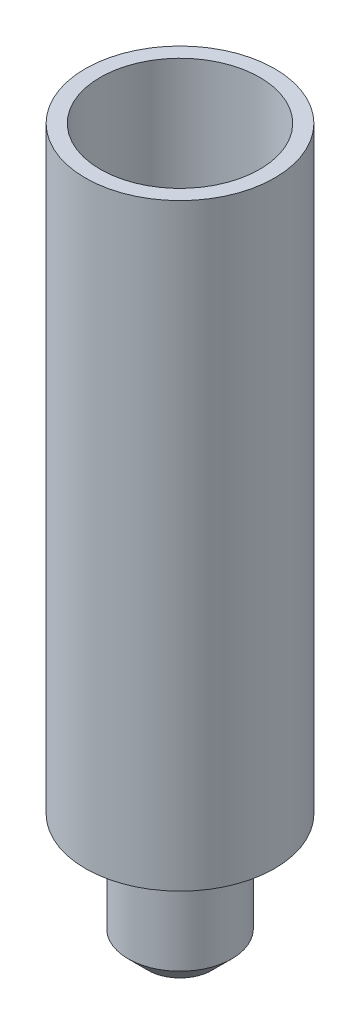
ISO-10303-21;
HEADER;
FILE_DESCRIPTION(('STEP AP214'),'2;1');
FILE_NAME('part.step','',(''),(''),'','','');
FILE_SCHEMA(('AUTOMOTIVE_DESIGN { 1 0 10303 214 1 1 1 1 }'));
ENDSEC;
DATA;
#1=APPLICATION_CONTEXT('core data for automotive mechanical design processes');
#2=APPLICATION_PROTOCOL_DEFINITION('international standard','automotive_design',2000,#1);
#3=PRODUCT_CONTEXT('',#1,'mechanical');
#4=PRODUCT('Part','Part','',(#3));
#5=PRODUCT_RELATED_PRODUCT_CATEGORY('part','',(#4));
#6=PRODUCT_DEFINITION_FORMATION('','',#4);
#7=PRODUCT_DEFINITION_CONTEXT('part definition',#1,'design');
#8=PRODUCT_DEFINITION('design','',#6,#7);
#9=PRODUCT_DEFINITION_SHAPE('','',#8);
#10=(LENGTH_UNIT() NAMED_UNIT(*) SI_UNIT(.MILLI.,.METRE.));
#11=(NAMED_UNIT(*) PLANE_ANGLE_UNIT() SI_UNIT($,.RADIAN.));
#12=(NAMED_UNIT(*) SI_UNIT($,.STERADIAN.) SOLID_ANGLE_UNIT());
#13=UNCERTAINTY_MEASURE_WITH_UNIT(LENGTH_MEASURE(1.E-05),#10,'distance_accuracy_value','');
#14=(GEOMETRIC_REPRESENTATION_CONTEXT(3) GLOBAL_UNCERTAINTY_ASSIGNED_CONTEXT((#13)) GLOBAL_UNIT_ASSIGNED_CONTEXT((#10,
#11,#12)) REPRESENTATION_CONTEXT('',''));
#15=CARTESIAN_POINT('',(0.,0.,0.));
#16=DIRECTION('',(0.,0.,1.));
#17=DIRECTION('',(1.,0.,0.));
#18=AXIS2_PLACEMENT_3D('',#15,#16,#17);
#19=CARTESIAN_POINT('',(0.,6.,0.));
#20=DIRECTION('',(0.,-1.,0.));
#21=DIRECTION('',(0.,0.,-1.));
#22=AXIS2_PLACEMENT_3D('',#19,#20,#21);
#23=CYLINDRICAL_SURFACE('',#22,2.6);
#24=CARTESIAN_POINT('',(0.,0.99999999999999,0.));
#25=DIRECTION('',(0.,1.,0.));
#26=DIRECTION('',(0.,0.,1.));
#27=AXIS2_PLACEMENT_3D('',#24,#25,#26);
#28=CIRCLE('',#27,2.6);
#29=CARTESIAN_POINT('',(0.,0.99999999999999,2.6));
#30=VERTEX_POINT('',#29);
#31=EDGE_CURVE('E46',#30,#30,#28,.T.);
#32=ORIENTED_EDGE('',*,*,#31,.T.);
#33=EDGE_LOOP('',(#32));
#34=FACE_BOUND('',#33,.T.);
#35=CARTESIAN_POINT('',(0.,6.,0.));
#36=DIRECTION('',(0.,1.,0.));
#37=DIRECTION('',(0.,0.,1.));
#38=AXIS2_PLACEMENT_3D('',#35,#36,#37);
#39=CIRCLE('',#38,2.6);
#40=CARTESIAN_POINT('',(0.,6.,2.6));
#41=VERTEX_POINT('',#40);
#42=EDGE_CURVE('E54',#41,#41,#39,.T.);
#43=ORIENTED_EDGE('',*,*,#42,.F.);
#44=EDGE_LOOP('',(#43));
#45=FACE_BOUND('',#44,.T.);
#46=ADVANCED_FACE('F38',(#34,#45),#23,.T.);
#47=CARTESIAN_POINT('',(0.,0.,0.));
#48=DIRECTION('',(0.,1.,0.));
#49=DIRECTION('',(0.,0.,1.));
#50=AXIS2_PLACEMENT_3D('',#47,#48,#49);
#51=PLANE('',#50);
#52=CARTESIAN_POINT('',(0.,0.,0.));
#53=DIRECTION('',(0.,1.,0.));
#54=DIRECTION('',(0.,0.,1.));
#55=AXIS2_PLACEMENT_3D('',#52,#53,#54);
#56=CIRCLE('',#55,1.60000000000001);
#57=CARTESIAN_POINT('',(0.,0.,1.60000000000001));
#58=VERTEX_POINT('',#57);
#59=EDGE_CURVE('E10',#58,#58,#56,.F.);
#60=ORIENTED_EDGE('',*,*,#59,.T.);
#61=EDGE_LOOP('',(#60));
#62=FACE_BOUND('',#61,.T.);
#63=CARTESIAN_POINT('',(0.,0.,0.));
#64=DIRECTION('',(0.,-1.,0.));
#65=DIRECTION('',(0.,0.,-1.));
#66=AXIS2_PLACEMENT_3D('',#63,#64,#65);
#67=CIRCLE('',#66,1.025);
#68=CARTESIAN_POINT('',(0.,0.,-1.025));
#69=VERTEX_POINT('',#68);
#70=EDGE_CURVE('E74',#69,#69,#67,.T.);
#71=ORIENTED_EDGE('',*,*,#70,.F.);
#72=EDGE_LOOP('',(#71));
#73=FACE_BOUND('',#72,.T.);
#74=ADVANCED_FACE('F80',(#62,#73),#51,.F.);
#75=CARTESIAN_POINT('',(0.,8.5,0.));
#76=DIRECTION('',(0.,-1.,0.));
#77=DIRECTION('',(0.,0.,-1.));
#78=AXIS2_PLACEMENT_3D('',#75,#76,#77);
#79=CYLINDRICAL_SURFACE('',#78,4.75);
#80=CARTESIAN_POINT('',(0.,6.,0.));
#81=DIRECTION('',(0.,1.,0.));
#82=DIRECTION('',(0.,0.,1.));
#83=AXIS2_PLACEMENT_3D('',#80,#81,#82);
#84=CIRCLE('',#83,4.75);
#85=CARTESIAN_POINT('',(0.,6.,4.75));
#86=VERTEX_POINT('',#85);
#87=EDGE_CURVE('E59',#86,#86,#84,.T.);
#88=ORIENTED_EDGE('',*,*,#87,.T.);
#89=EDGE_LOOP('',(#88));
#90=FACE_BOUND('',#89,.T.);
#91=CARTESIAN_POINT('',(0.,36.,0.));
#92=DIRECTION('',(0.,1.,0.));
#93=DIRECTION('',(0.,0.,1.));
#94=AXIS2_PLACEMENT_3D('',#91,#92,#93);
#95=CIRCLE('',#94,4.75);
#96=CARTESIAN_POINT('',(0.,36.,4.75));
#97=VERTEX_POINT('',#96);
#98=EDGE_CURVE('E62',#97,#97,#95,.T.);
#99=ORIENTED_EDGE('',*,*,#98,.F.);
#100=EDGE_LOOP('',(#99));
#101=FACE_BOUND('',#100,.T.);
#102=ADVANCED_FACE('F82',(#90,#101),#79,.T.);
#103=CARTESIAN_POINT('',(0.,6.,0.));
#104=DIRECTION('',(0.,1.,0.));
#105=DIRECTION('',(0.,0.,1.));
#106=AXIS2_PLACEMENT_3D('',#103,#104,#105);
#107=PLANE('',#106);
#108=ORIENTED_EDGE('',*,*,#42,.T.);
#109=EDGE_LOOP('',(#108));
#110=FACE_BOUND('',#109,.T.);
#111=ORIENTED_EDGE('',*,*,#87,.F.);
#112=EDGE_LOOP('',(#111));
#113=FACE_BOUND('',#112,.T.);
#114=ADVANCED_FACE('F88',(#110,#113),#107,.F.);
#115=CARTESIAN_POINT('',(0.,36.,0.));
#116=DIRECTION('',(0.,1.,0.));
#117=DIRECTION('',(0.,0.,1.));
#118=AXIS2_PLACEMENT_3D('',#115,#116,#117);
#119=PLANE('',#118);
#120=ORIENTED_EDGE('',*,*,#98,.T.);
#121=EDGE_LOOP('',(#120));
#122=FACE_BOUND('',#121,.T.);
#123=CARTESIAN_POINT('',(0.,36.,0.));
#124=DIRECTION('',(0.,1.,0.));
#125=DIRECTION('',(0.,0.,1.));
#126=AXIS2_PLACEMENT_3D('',#123,#124,#125);
#127=CIRCLE('',#126,4.);
#128=CARTESIAN_POINT('',(0.,36.,4.));
#129=VERTEX_POINT('',#128);
#130=EDGE_CURVE('E65',#129,#129,#127,.T.);
#131=ORIENTED_EDGE('',*,*,#130,.F.);
#132=EDGE_LOOP('',(#131));
#133=FACE_BOUND('',#132,.T.);
#134=ADVANCED_FACE('F94',(#122,#133),#119,.T.);
#135=CARTESIAN_POINT('',(0.,36.,0.));
#136=DIRECTION('',(0.,-1.,0.));
#137=DIRECTION('',(0.,0.,-1.));
#138=AXIS2_PLACEMENT_3D('',#135,#136,#137);
#139=CYLINDRICAL_SURFACE('',#138,4.);
#140=ORIENTED_EDGE('',*,*,#130,.T.);
#141=EDGE_LOOP('',(#140));
#142=FACE_BOUND('',#141,.T.);
#143=CARTESIAN_POINT('',(0.,8.5,0.));
#144=DIRECTION('',(0.,1.,0.));
#145=DIRECTION('',(0.,0.,1.));
#146=AXIS2_PLACEMENT_3D('',#143,#144,#145);
#147=CIRCLE('',#146,4.);
#148=CARTESIAN_POINT('',(0.,8.5,4.));
#149=VERTEX_POINT('',#148);
#150=EDGE_CURVE('E50',#149,#149,#147,.F.);
#151=ORIENTED_EDGE('',*,*,#150,.T.);
#152=EDGE_LOOP('',(#151));
#153=FACE_BOUND('',#152,.T.);
#154=ADVANCED_FACE('F100',(#142,#153),#139,.F.);
#155=CARTESIAN_POINT('',(0.,8.5,0.));
#156=DIRECTION('',(0.,1.,0.));
#157=DIRECTION('',(0.,0.,1.));
#158=AXIS2_PLACEMENT_3D('',#155,#156,#157);
#159=PLANE('',#158);
#160=CARTESIAN_POINT('',(0.,8.5,0.));
#161=DIRECTION('',(0.,1.,0.));
#162=DIRECTION('',(0.,0.,1.));
#163=AXIS2_PLACEMENT_3D('',#160,#161,#162);
#164=CIRCLE('',#163,0.799999999999999);
#165=CARTESIAN_POINT('',(0.,8.5,0.799999999999999));
#166=VERTEX_POINT('',#165);
#167=EDGE_CURVE('E68',#166,#166,#164,.T.);
#168=ORIENTED_EDGE('',*,*,#167,.F.);
#169=EDGE_LOOP('',(#168));
#170=FACE_BOUND('',#169,.T.);
#171=ORIENTED_EDGE('',*,*,#150,.F.);
#172=EDGE_LOOP('',(#171));
#173=FACE_BOUND('',#172,.T.);
#174=ADVANCED_FACE('F96',(#170,#173),#159,.T.);
#175=CARTESIAN_POINT('',(0.,0.,0.));
#176=DIRECTION('',(0.,-1.,0.));
#177=DIRECTION('',(0.,0.,-1.));
#178=AXIS2_PLACEMENT_3D('',#175,#176,#177);
#179=CYLINDRICAL_SURFACE('',#178,0.799999999999999);
#180=CARTESIAN_POINT('',(0.,0.225,0.));
#181=DIRECTION('',(0.,-1.,0.));
#182=DIRECTION('',(0.,0.,-1.));
#183=AXIS2_PLACEMENT_3D('',#180,#181,#182);
#184=CIRCLE('',#183,0.8);
#185=CARTESIAN_POINT('',(0.,0.225,-0.8));
#186=VERTEX_POINT('',#185);
#187=EDGE_CURVE('E71',#186,#186,#184,.T.);
#188=ORIENTED_EDGE('',*,*,#187,.T.);
#189=EDGE_LOOP('',(#188));
#190=FACE_BOUND('',#189,.T.);
#191=ORIENTED_EDGE('',*,*,#167,.T.);
#192=EDGE_LOOP('',(#191));
#193=FACE_BOUND('',#192,.T.);
#194=ADVANCED_FACE('F99',(#190,#193),#179,.F.);
#195=CARTESIAN_POINT('',(0.,0.,0.));
#196=DIRECTION('',(0.,-1.,0.));
#197=DIRECTION('',(0.,0.,-1.));
#198=AXIS2_PLACEMENT_3D('',#195,#196,#197);
#199=CONICAL_SURFACE('',#198,1.025,0.785398163397447);
#200=ORIENTED_EDGE('',*,*,#187,.F.);
#201=EDGE_LOOP('',(#200));
#202=FACE_BOUND('',#201,.T.);
#203=ORIENTED_EDGE('',*,*,#70,.T.);
#204=EDGE_LOOP('',(#203));
#205=FACE_BOUND('',#204,.T.);
#206=ADVANCED_FACE('F78',(#202,#205),#199,.F.);
#207=CARTESIAN_POINT('',(0.,0.99999999999999,0.));
#208=DIRECTION('',(0.,1.,0.));
#209=DIRECTION('',(0.,0.,1.));
#210=AXIS2_PLACEMENT_3D('',#207,#208,#209);
#211=CONICAL_SURFACE('',#210,2.6,0.785398163397449);
#212=ORIENTED_EDGE('',*,*,#59,.F.);
#213=EDGE_LOOP('',(#212));
#214=FACE_BOUND('',#213,.T.);
#215=ORIENTED_EDGE('',*,*,#31,.F.);
#216=EDGE_LOOP('',(#215));
#217=FACE_BOUND('',#216,.T.);
#218=ADVANCED_FACE('F41',(#214,#217),#211,.T.);
#219=CLOSED_SHELL('',(#46,#74,#102,#114,#134,#154,#174,#194,#206,#218));
#220=MANIFOLD_SOLID_BREP('B2',#219);
#221=ADVANCED_BREP_SHAPE_REPRESENTATION('',(#18,#220),#14);
#222=SHAPE_DEFINITION_REPRESENTATION(#9,#221);
ENDSEC;
END-ISO-10303-21;
